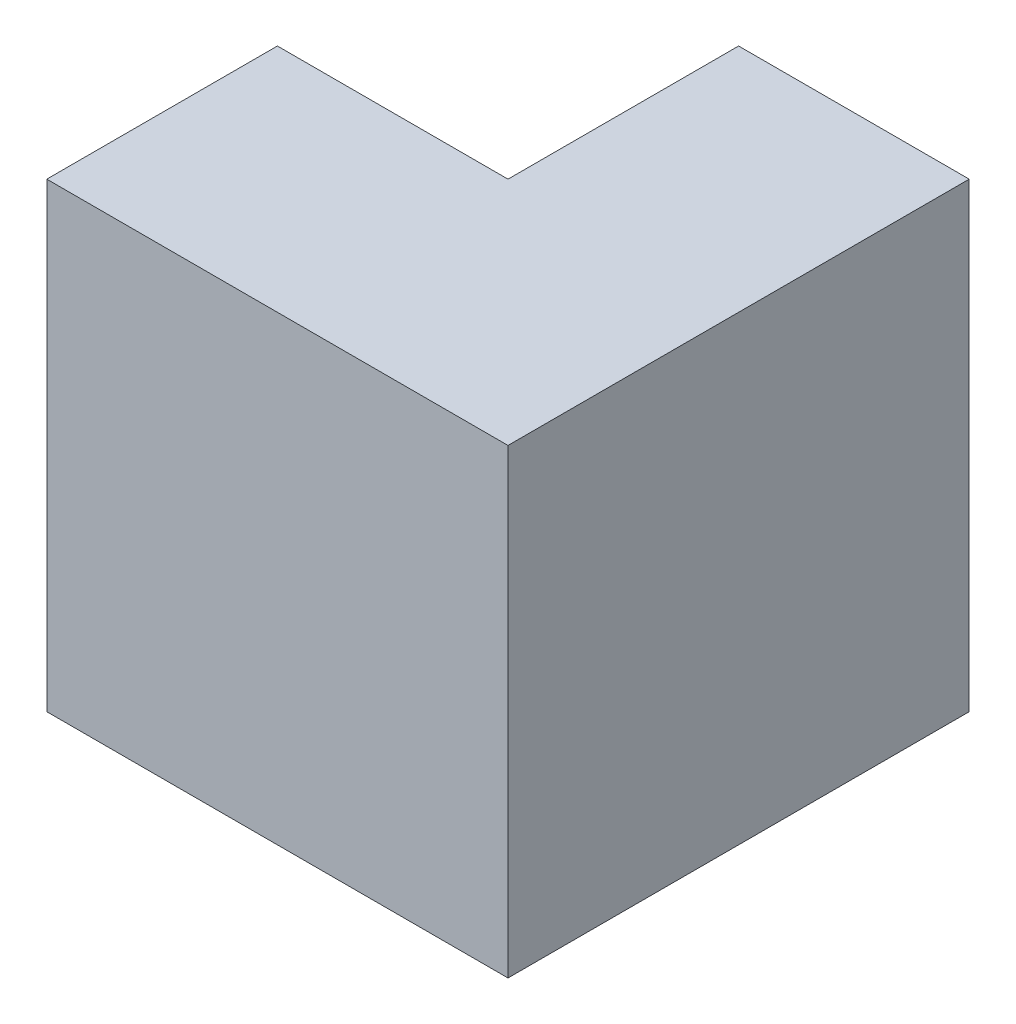
ISO-10303-21;
HEADER;
FILE_DESCRIPTION(('STEP AP214'),'2;1');
FILE_NAME('part.step','',(''),(''),'','','');
FILE_SCHEMA(('AUTOMOTIVE_DESIGN { 1 0 10303 214 1 1 1 1 }'));
ENDSEC;
DATA;
#1=APPLICATION_CONTEXT('core data for automotive mechanical design processes');
#2=APPLICATION_PROTOCOL_DEFINITION('international standard','automotive_design',2000,#1);
#3=PRODUCT_CONTEXT('',#1,'mechanical');
#4=PRODUCT('Part','Part','',(#3));
#5=PRODUCT_RELATED_PRODUCT_CATEGORY('part','',(#4));
#6=PRODUCT_DEFINITION_FORMATION('','',#4);
#7=PRODUCT_DEFINITION_CONTEXT('part definition',#1,'design');
#8=PRODUCT_DEFINITION('design','',#6,#7);
#9=PRODUCT_DEFINITION_SHAPE('','',#8);
#10=(LENGTH_UNIT() NAMED_UNIT(*) SI_UNIT(.MILLI.,.METRE.));
#11=(NAMED_UNIT(*) PLANE_ANGLE_UNIT() SI_UNIT($,.RADIAN.));
#12=(NAMED_UNIT(*) SI_UNIT($,.STERADIAN.) SOLID_ANGLE_UNIT());
#13=UNCERTAINTY_MEASURE_WITH_UNIT(LENGTH_MEASURE(1.E-05),#10,'distance_accuracy_value','');
#14=(GEOMETRIC_REPRESENTATION_CONTEXT(3) GLOBAL_UNCERTAINTY_ASSIGNED_CONTEXT((#13)) GLOBAL_UNIT_ASSIGNED_CONTEXT((#10,
#11,#12)) REPRESENTATION_CONTEXT('',''));
#15=CARTESIAN_POINT('',(0.,0.,0.));
#16=DIRECTION('',(0.,0.,1.));
#17=DIRECTION('',(1.,0.,0.));
#18=AXIS2_PLACEMENT_3D('',#15,#16,#17);
#19=CARTESIAN_POINT('',(-26.7808219178082,40.,32.8082191780822));
#20=DIRECTION('',(1.,0.,0.));
#21=DIRECTION('',(0.,0.,-1.));
#22=AXIS2_PLACEMENT_3D('',#19,#20,#21);
#23=PLANE('',#22);
#24=DIRECTION('',(0.,0.,1.));
#25=VECTOR('',#24,1.);
#26=CARTESIAN_POINT('',(-26.7808219178082,0.,32.8082191780822));
#27=LINE('',#26,#25);
#28=CARTESIAN_POINT('',(-26.7808219178082,0.,12.8082191780822));
#29=VERTEX_POINT('',#28);
#30=CARTESIAN_POINT('',(-26.7808219178082,0.,32.8082191780822));
#31=VERTEX_POINT('',#30);
#32=EDGE_CURVE('E134',#29,#31,#27,.T.);
#33=ORIENTED_EDGE('',*,*,#32,.T.);
#34=DIRECTION('',(0.,-1.,0.));
#35=VECTOR('',#34,1.);
#36=CARTESIAN_POINT('',(-26.7808219178082,40.,32.8082191780822));
#37=LINE('',#36,#35);
#38=CARTESIAN_POINT('',(-26.7808219178082,40.,32.8082191780822));
#39=VERTEX_POINT('',#38);
#40=EDGE_CURVE('E152',#39,#31,#37,.T.);
#41=ORIENTED_EDGE('',*,*,#40,.F.);
#42=DIRECTION('',(0.,0.,1.));
#43=VECTOR('',#42,1.);
#44=CARTESIAN_POINT('',(-26.7808219178082,40.,32.8082191780822));
#45=LINE('',#44,#43);
#46=CARTESIAN_POINT('',(-26.7808219178082,40.,12.8082191780822));
#47=VERTEX_POINT('',#46);
#48=EDGE_CURVE('E77',#47,#39,#45,.T.);
#49=ORIENTED_EDGE('',*,*,#48,.F.);
#50=DIRECTION('',(0.,-1.,0.));
#51=VECTOR('',#50,1.);
#52=CARTESIAN_POINT('',(-26.7808219178082,40.,12.8082191780822));
#53=LINE('',#52,#51);
#54=EDGE_CURVE('E45',#47,#29,#53,.T.);
#55=ORIENTED_EDGE('',*,*,#54,.T.);
#56=EDGE_LOOP('',(#33,#41,#49,#55));
#57=FACE_BOUND('',#56,.T.);
#58=ADVANCED_FACE('F37',(#57),#23,.F.);
#59=CARTESIAN_POINT('',(-6.7808219178082,40.,32.8082191780822));
#60=DIRECTION('',(0.,0.,-1.));
#61=DIRECTION('',(-1.,0.,0.));
#62=AXIS2_PLACEMENT_3D('',#59,#60,#61);
#63=PLANE('',#62);
#64=DIRECTION('',(1.,0.,0.));
#65=VECTOR('',#64,1.);
#66=CARTESIAN_POINT('',(-6.7808219178082,0.,32.8082191780822));
#67=LINE('',#66,#65);
#68=CARTESIAN_POINT('',(13.2191780821918,0.,32.8082191780822));
#69=VERTEX_POINT('',#68);
#70=EDGE_CURVE('E67',#31,#69,#67,.T.);
#71=ORIENTED_EDGE('',*,*,#70,.T.);
#72=DIRECTION('',(0.,-1.,0.));
#73=VECTOR('',#72,1.);
#74=CARTESIAN_POINT('',(13.2191780821918,40.,32.8082191780822));
#75=LINE('',#74,#73);
#76=CARTESIAN_POINT('',(13.2191780821918,40.,32.8082191780822));
#77=VERTEX_POINT('',#76);
#78=EDGE_CURVE('E150',#77,#69,#75,.T.);
#79=ORIENTED_EDGE('',*,*,#78,.F.);
#80=DIRECTION('',(1.,0.,0.));
#81=VECTOR('',#80,1.);
#82=CARTESIAN_POINT('',(-6.7808219178082,40.,32.8082191780822));
#83=LINE('',#82,#81);
#84=EDGE_CURVE('E143',#39,#77,#83,.T.);
#85=ORIENTED_EDGE('',*,*,#84,.F.);
#86=ORIENTED_EDGE('',*,*,#40,.T.);
#87=EDGE_LOOP('',(#71,#79,#85,#86));
#88=FACE_BOUND('',#87,.T.);
#89=ADVANCED_FACE('F172',(#88),#63,.F.);
#90=CARTESIAN_POINT('',(13.2191780821918,40.,-7.19178082191776));
#91=DIRECTION('',(-1.,0.,0.));
#92=DIRECTION('',(0.,0.,1.));
#93=AXIS2_PLACEMENT_3D('',#90,#91,#92);
#94=PLANE('',#93);
#95=DIRECTION('',(0.,0.,-1.));
#96=VECTOR('',#95,1.);
#97=CARTESIAN_POINT('',(13.2191780821918,0.,-7.19178082191776));
#98=LINE('',#97,#96);
#99=CARTESIAN_POINT('',(13.2191780821918,0.,-7.19178082191776));
#100=VERTEX_POINT('',#99);
#101=EDGE_CURVE('E72',#69,#100,#98,.T.);
#102=ORIENTED_EDGE('',*,*,#101,.T.);
#103=DIRECTION('',(0.,-1.,0.));
#104=VECTOR('',#103,1.);
#105=CARTESIAN_POINT('',(13.2191780821918,40.,-7.19178082191776));
#106=LINE('',#105,#104);
#107=CARTESIAN_POINT('',(13.2191780821918,40.,-7.19178082191776));
#108=VERTEX_POINT('',#107);
#109=EDGE_CURVE('E115',#108,#100,#106,.T.);
#110=ORIENTED_EDGE('',*,*,#109,.F.);
#111=DIRECTION('',(0.,0.,-1.));
#112=VECTOR('',#111,1.);
#113=CARTESIAN_POINT('',(13.2191780821918,40.,-7.19178082191776));
#114=LINE('',#113,#112);
#115=EDGE_CURVE('E53',#77,#108,#114,.T.);
#116=ORIENTED_EDGE('',*,*,#115,.F.);
#117=ORIENTED_EDGE('',*,*,#78,.T.);
#118=EDGE_LOOP('',(#102,#110,#116,#117));
#119=FACE_BOUND('',#118,.T.);
#120=ADVANCED_FACE('F176',(#119),#94,.F.);
#121=CARTESIAN_POINT('',(-6.78082191780821,40.,-7.19178082191776));
#122=DIRECTION('',(0.,0.,1.));
#123=DIRECTION('',(1.,0.,0.));
#124=AXIS2_PLACEMENT_3D('',#121,#122,#123);
#125=PLANE('',#124);
#126=DIRECTION('',(-1.,0.,0.));
#127=VECTOR('',#126,1.);
#128=CARTESIAN_POINT('',(-6.78082191780821,0.,-7.19178082191776));
#129=LINE('',#128,#127);
#130=CARTESIAN_POINT('',(-6.78082191780821,0.,-7.19178082191776));
#131=VERTEX_POINT('',#130);
#132=EDGE_CURVE('E127',#100,#131,#129,.T.);
#133=ORIENTED_EDGE('',*,*,#132,.T.);
#134=DIRECTION('',(0.,-1.,0.));
#135=VECTOR('',#134,1.);
#136=CARTESIAN_POINT('',(-6.78082191780821,40.,-7.19178082191776));
#137=LINE('',#136,#135);
#138=CARTESIAN_POINT('',(-6.78082191780821,40.,-7.19178082191776));
#139=VERTEX_POINT('',#138);
#140=EDGE_CURVE('E108',#139,#131,#137,.T.);
#141=ORIENTED_EDGE('',*,*,#140,.F.);
#142=DIRECTION('',(-1.,0.,0.));
#143=VECTOR('',#142,1.);
#144=CARTESIAN_POINT('',(-6.78082191780821,40.,-7.19178082191776));
#145=LINE('',#144,#143);
#146=EDGE_CURVE('E116',#108,#139,#145,.T.);
#147=ORIENTED_EDGE('',*,*,#146,.F.);
#148=ORIENTED_EDGE('',*,*,#109,.T.);
#149=EDGE_LOOP('',(#133,#141,#147,#148));
#150=FACE_BOUND('',#149,.T.);
#151=ADVANCED_FACE('F128',(#150),#125,.F.);
#152=CARTESIAN_POINT('',(0.,40.,0.));
#153=DIRECTION('',(0.,-1.,0.));
#154=DIRECTION('',(0.,0.,-1.));
#155=AXIS2_PLACEMENT_3D('',#152,#153,#154);
#156=PLANE('',#155);
#157=ORIENTED_EDGE('',*,*,#146,.T.);
#158=DIRECTION('',(0.,0.,1.));
#159=VECTOR('',#158,1.);
#160=CARTESIAN_POINT('',(-6.7808219178082,40.,-27.1917808219178));
#161=LINE('',#160,#159);
#162=CARTESIAN_POINT('',(-6.7808219178082,40.,12.8082191780822));
#163=VERTEX_POINT('',#162);
#164=EDGE_CURVE('E111',#139,#163,#161,.T.);
#165=ORIENTED_EDGE('',*,*,#164,.T.);
#166=DIRECTION('',(-1.,0.,0.));
#167=VECTOR('',#166,1.);
#168=CARTESIAN_POINT('',(-26.7808219178082,40.,12.8082191780822));
#169=LINE('',#168,#167);
#170=EDGE_CURVE('E124',#163,#47,#169,.T.);
#171=ORIENTED_EDGE('',*,*,#170,.T.);
#172=ORIENTED_EDGE('',*,*,#48,.T.);
#173=ORIENTED_EDGE('',*,*,#84,.T.);
#174=ORIENTED_EDGE('',*,*,#115,.T.);
#175=EDGE_LOOP('',(#157,#165,#171,#172,#173,#174));
#176=FACE_BOUND('',#175,.T.);
#177=ADVANCED_FACE('F158',(#176),#156,.F.);
#178=CARTESIAN_POINT('',(0.,0.,0.));
#179=DIRECTION('',(0.,-1.,0.));
#180=DIRECTION('',(0.,0.,-1.));
#181=AXIS2_PLACEMENT_3D('',#178,#179,#180);
#182=PLANE('',#181);
#183=DIRECTION('',(0.707106781186547,0.,-0.707106781186548));
#184=VECTOR('',#183,1.);
#185=CARTESIAN_POINT('',(-6.78082191780821,0.,-7.19178082191776));
#186=LINE('',#185,#184);
#187=EDGE_CURVE('E123',#29,#131,#186,.T.);
#188=ORIENTED_EDGE('',*,*,#187,.T.);
#189=ORIENTED_EDGE('',*,*,#132,.F.);
#190=ORIENTED_EDGE('',*,*,#101,.F.);
#191=ORIENTED_EDGE('',*,*,#70,.F.);
#192=ORIENTED_EDGE('',*,*,#32,.F.);
#193=EDGE_LOOP('',(#188,#189,#190,#191,#192));
#194=FACE_BOUND('',#193,.T.);
#195=ADVANCED_FACE('F132',(#194),#182,.T.);
#196=CARTESIAN_POINT('',(-6.78082191780821,40.,-7.19178082191776));
#197=DIRECTION('',(-0.707106781186548,0.,-0.707106781186547));
#198=DIRECTION('',(-0.707106781186547,0.,0.707106781186548));
#199=AXIS2_PLACEMENT_3D('',#196,#197,#198);
#200=PLANE('',#199);
#201=DIRECTION('',(-0.408248290463863,0.816496580927726,0.408248290463863));
#202=VECTOR('',#201,1.);
#203=CARTESIAN_POINT('',(-20.1141552511415,26.6666666666667,6.14155251141559));
#204=LINE('',#203,#202);
#205=CARTESIAN_POINT('',(-16.7808219178082,20.,2.80821917808225));
#206=VERTEX_POINT('',#205);
#207=EDGE_CURVE('E101',#131,#206,#204,.T.);
#208=ORIENTED_EDGE('',*,*,#207,.F.);
#209=ORIENTED_EDGE('',*,*,#187,.F.);
#210=DIRECTION('',(-0.408248290463863,-0.816496580927726,0.408248290463863));
#211=VECTOR('',#210,1.);
#212=CARTESIAN_POINT('',(-6.7808219178082,40.,-7.19178082191777));
#213=LINE('',#212,#211);
#214=EDGE_CURVE('E11',#206,#29,#213,.T.);
#215=ORIENTED_EDGE('',*,*,#214,.F.);
#216=EDGE_LOOP('',(#208,#209,#215));
#217=FACE_BOUND('',#216,.T.);
#218=ADVANCED_FACE('F121',(#217),#200,.T.);
#219=CARTESIAN_POINT('',(-6.7808219178082,40.,-27.1917808219178));
#220=DIRECTION('',(0.894427190999916,-0.447213595499958,0.));
#221=DIRECTION('',(0.447213595499958,0.894427190999916,0.));
#222=AXIS2_PLACEMENT_3D('',#219,#220,#221);
#223=PLANE('',#222);
#224=DIRECTION('',(0.447213595499958,0.894427190999916,0.));
#225=VECTOR('',#224,1.);
#226=CARTESIAN_POINT('',(-6.7808219178082,40.,12.8082191780822));
#227=LINE('',#226,#225);
#228=EDGE_CURVE('E138',#29,#163,#227,.T.);
#229=ORIENTED_EDGE('',*,*,#228,.T.);
#230=DIRECTION('',(-0.408248290463863,-0.816496580927726,-0.408248290463863));
#231=VECTOR('',#230,1.);
#232=CARTESIAN_POINT('',(-13.4474885844749,26.6666666666667,6.14155251141558));
#233=LINE('',#232,#231);
#234=EDGE_CURVE('E103',#163,#206,#233,.T.);
#235=ORIENTED_EDGE('',*,*,#234,.T.);
#236=ORIENTED_EDGE('',*,*,#214,.T.);
#237=EDGE_LOOP('',(#229,#235,#236));
#238=FACE_BOUND('',#237,.T.);
#239=ADVANCED_FACE('F162',(#238),#223,.F.);
#240=CARTESIAN_POINT('',(0.,0.,12.8082191780822));
#241=DIRECTION('',(0.,0.,1.));
#242=DIRECTION('',(1.,0.,0.));
#243=AXIS2_PLACEMENT_3D('',#240,#241,#242);
#244=PLANE('',#243);
#245=ORIENTED_EDGE('',*,*,#170,.F.);
#246=ORIENTED_EDGE('',*,*,#228,.F.);
#247=ORIENTED_EDGE('',*,*,#54,.F.);
#248=EDGE_LOOP('',(#245,#246,#247));
#249=FACE_BOUND('',#248,.T.);
#250=ADVANCED_FACE('F156',(#249),#244,.F.);
#251=CARTESIAN_POINT('',(-46.7808219178082,40.,12.8082191780822));
#252=DIRECTION('',(0.,-0.447213595499958,0.894427190999916));
#253=DIRECTION('',(0.,-0.894427190999916,-0.447213595499958));
#254=AXIS2_PLACEMENT_3D('',#251,#252,#253);
#255=PLANE('',#254);
#256=ORIENTED_EDGE('',*,*,#207,.T.);
#257=ORIENTED_EDGE('',*,*,#234,.F.);
#258=DIRECTION('',(0.,-0.894427190999916,-0.447213595499958));
#259=VECTOR('',#258,1.);
#260=CARTESIAN_POINT('',(-6.78082191780821,40.,12.8082191780822));
#261=LINE('',#260,#259);
#262=EDGE_CURVE('E97',#163,#131,#261,.T.);
#263=ORIENTED_EDGE('',*,*,#262,.T.);
#264=EDGE_LOOP('',(#256,#257,#263));
#265=FACE_BOUND('',#264,.T.);
#266=ADVANCED_FACE('F99',(#265),#255,.F.);
#267=CARTESIAN_POINT('',(-6.78082191780821,0.,0.));
#268=DIRECTION('',(-1.,0.,0.));
#269=DIRECTION('',(0.,0.,1.));
#270=AXIS2_PLACEMENT_3D('',#267,#268,#269);
#271=PLANE('',#270);
#272=ORIENTED_EDGE('',*,*,#164,.F.);
#273=ORIENTED_EDGE('',*,*,#140,.T.);
#274=ORIENTED_EDGE('',*,*,#262,.F.);
#275=EDGE_LOOP('',(#272,#273,#274));
#276=FACE_BOUND('',#275,.T.);
#277=ADVANCED_FACE('F109',(#276),#271,.T.);
#278=CLOSED_SHELL('',(#58,#89,#120,#151,#177,#195,#218,#239,#250,#266,#277));
#279=MANIFOLD_SOLID_BREP('B2',#278);
#280=ADVANCED_BREP_SHAPE_REPRESENTATION('',(#18,#279),#14);
#281=SHAPE_DEFINITION_REPRESENTATION(#9,#280);
ENDSEC;
END-ISO-10303-21;
